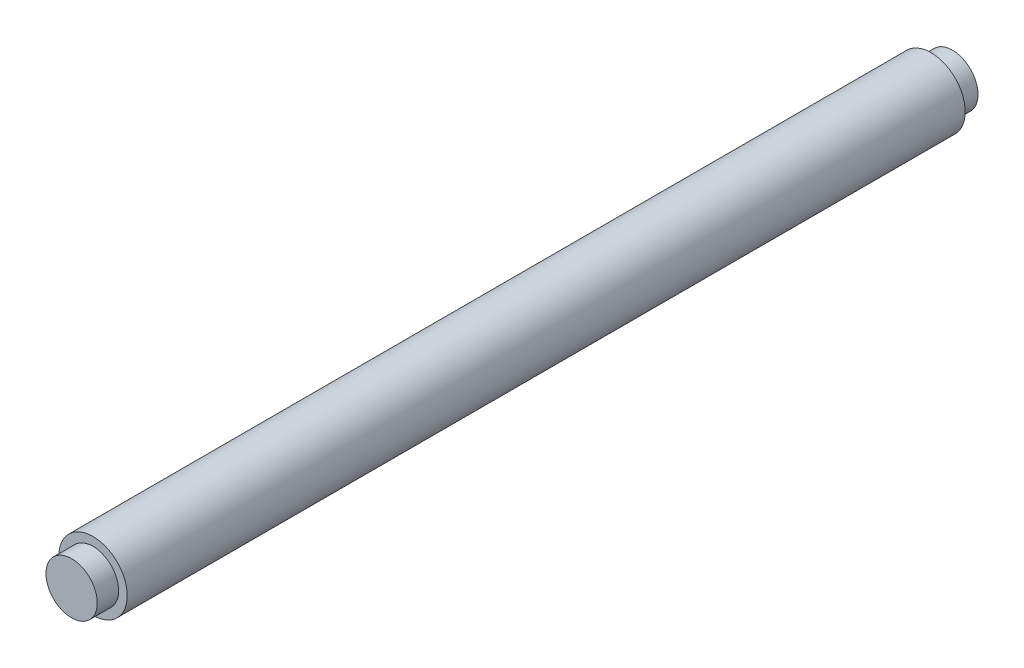
ISO-10303-21;
HEADER;
FILE_DESCRIPTION(('STEP AP214'),'2;1');
FILE_NAME('part.step','',(''),(''),'','','');
FILE_SCHEMA(('AUTOMOTIVE_DESIGN { 1 0 10303 214 1 1 1 1 }'));
ENDSEC;
DATA;
#1=APPLICATION_CONTEXT('core data for automotive mechanical design processes');
#2=APPLICATION_PROTOCOL_DEFINITION('international standard','automotive_design',2000,#1);
#3=PRODUCT_CONTEXT('',#1,'mechanical');
#4=PRODUCT('Part','Part','',(#3));
#5=PRODUCT_RELATED_PRODUCT_CATEGORY('part','',(#4));
#6=PRODUCT_DEFINITION_FORMATION('','',#4);
#7=PRODUCT_DEFINITION_CONTEXT('part definition',#1,'design');
#8=PRODUCT_DEFINITION('design','',#6,#7);
#9=PRODUCT_DEFINITION_SHAPE('','',#8);
#10=(LENGTH_UNIT() NAMED_UNIT(*) SI_UNIT(.MILLI.,.METRE.));
#11=(NAMED_UNIT(*) PLANE_ANGLE_UNIT() SI_UNIT($,.RADIAN.));
#12=(NAMED_UNIT(*) SI_UNIT($,.STERADIAN.) SOLID_ANGLE_UNIT());
#13=UNCERTAINTY_MEASURE_WITH_UNIT(LENGTH_MEASURE(1.E-05),#10,'distance_accuracy_value','');
#14=(GEOMETRIC_REPRESENTATION_CONTEXT(3) GLOBAL_UNCERTAINTY_ASSIGNED_CONTEXT((#13)) GLOBAL_UNIT_ASSIGNED_CONTEXT((#10,
#11,#12)) REPRESENTATION_CONTEXT('',''));
#15=CARTESIAN_POINT('',(0.,0.,0.));
#16=DIRECTION('',(0.,0.,1.));
#17=DIRECTION('',(1.,0.,0.));
#18=AXIS2_PLACEMENT_3D('',#15,#16,#17);
#19=CARTESIAN_POINT('',(0.,0.,0.));
#20=DIRECTION('',(0.,0.,1.));
#21=DIRECTION('',(1.,0.,0.));
#22=AXIS2_PLACEMENT_3D('',#19,#20,#21);
#23=PLANE('',#22);
#24=CARTESIAN_POINT('',(0.,0.,0.));
#25=DIRECTION('',(0.,0.,1.));
#26=DIRECTION('',(1.,0.,0.));
#27=AXIS2_PLACEMENT_3D('',#24,#25,#26);
#28=CIRCLE('',#27,4.);
#29=CARTESIAN_POINT('',(4.,0.,0.));
#30=VERTEX_POINT('',#29);
#31=EDGE_CURVE('E48',#30,#30,#28,.T.);
#32=ORIENTED_EDGE('',*,*,#31,.F.);
#33=EDGE_LOOP('',(#32));
#34=FACE_BOUND('',#33,.T.);
#35=CARTESIAN_POINT('',(0.,0.,0.));
#36=DIRECTION('',(0.,0.,-1.));
#37=DIRECTION('',(-1.,0.,0.));
#38=AXIS2_PLACEMENT_3D('',#35,#36,#37);
#39=CIRCLE('',#38,3.);
#40=CARTESIAN_POINT('',(-3.,0.,0.));
#41=VERTEX_POINT('',#40);
#42=EDGE_CURVE('E10',#41,#41,#39,.T.);
#43=ORIENTED_EDGE('',*,*,#42,.F.);
#44=EDGE_LOOP('',(#43));
#45=FACE_BOUND('',#44,.T.);
#46=ADVANCED_FACE('F28',(#34,#45),#23,.F.);
#47=CARTESIAN_POINT('',(0.,0.,98.));
#48=DIRECTION('',(0.,0.,-1.));
#49=DIRECTION('',(-1.,0.,0.));
#50=AXIS2_PLACEMENT_3D('',#47,#48,#49);
#51=CYLINDRICAL_SURFACE('',#50,4.);
#52=CARTESIAN_POINT('',(0.,0.,98.));
#53=DIRECTION('',(0.,0.,1.));
#54=DIRECTION('',(1.,0.,0.));
#55=AXIS2_PLACEMENT_3D('',#52,#53,#54);
#56=CIRCLE('',#55,4.);
#57=CARTESIAN_POINT('',(4.,0.,98.));
#58=VERTEX_POINT('',#57);
#59=EDGE_CURVE('E32',#58,#58,#56,.T.);
#60=ORIENTED_EDGE('',*,*,#59,.F.);
#61=EDGE_LOOP('',(#60));
#62=FACE_BOUND('',#61,.T.);
#63=ORIENTED_EDGE('',*,*,#31,.T.);
#64=EDGE_LOOP('',(#63));
#65=FACE_BOUND('',#64,.T.);
#66=ADVANCED_FACE('F30',(#62,#65),#51,.T.);
#67=CARTESIAN_POINT('',(0.,0.,98.));
#68=DIRECTION('',(0.,0.,1.));
#69=DIRECTION('',(1.,0.,0.));
#70=AXIS2_PLACEMENT_3D('',#67,#68,#69);
#71=PLANE('',#70);
#72=CARTESIAN_POINT('',(0.,0.,98.));
#73=DIRECTION('',(0.,0.,1.));
#74=DIRECTION('',(1.,0.,0.));
#75=AXIS2_PLACEMENT_3D('',#72,#73,#74);
#76=CIRCLE('',#75,3.);
#77=CARTESIAN_POINT('',(3.,0.,98.));
#78=VERTEX_POINT('',#77);
#79=EDGE_CURVE('E36',#78,#78,#76,.T.);
#80=ORIENTED_EDGE('',*,*,#79,.F.);
#81=EDGE_LOOP('',(#80));
#82=FACE_BOUND('',#81,.T.);
#83=ORIENTED_EDGE('',*,*,#59,.T.);
#84=EDGE_LOOP('',(#83));
#85=FACE_BOUND('',#84,.T.);
#86=ADVANCED_FACE('F55',(#82,#85),#71,.T.);
#87=CARTESIAN_POINT('',(0.,0.,100.5));
#88=DIRECTION('',(0.,0.,-1.));
#89=DIRECTION('',(-1.,0.,0.));
#90=AXIS2_PLACEMENT_3D('',#87,#88,#89);
#91=CYLINDRICAL_SURFACE('',#90,3.);
#92=CARTESIAN_POINT('',(0.,0.,100.5));
#93=DIRECTION('',(0.,0.,1.));
#94=DIRECTION('',(1.,0.,0.));
#95=AXIS2_PLACEMENT_3D('',#92,#93,#94);
#96=CIRCLE('',#95,3.);
#97=CARTESIAN_POINT('',(3.,0.,100.5));
#98=VERTEX_POINT('',#97);
#99=EDGE_CURVE('E45',#98,#98,#96,.T.);
#100=ORIENTED_EDGE('',*,*,#99,.F.);
#101=EDGE_LOOP('',(#100));
#102=FACE_BOUND('',#101,.T.);
#103=ORIENTED_EDGE('',*,*,#79,.T.);
#104=EDGE_LOOP('',(#103));
#105=FACE_BOUND('',#104,.T.);
#106=ADVANCED_FACE('F62',(#102,#105),#91,.T.);
#107=CARTESIAN_POINT('',(0.,0.,100.5));
#108=DIRECTION('',(0.,0.,1.));
#109=DIRECTION('',(1.,0.,0.));
#110=AXIS2_PLACEMENT_3D('',#107,#108,#109);
#111=PLANE('',#110);
#112=ORIENTED_EDGE('',*,*,#99,.T.);
#113=EDGE_LOOP('',(#112));
#114=FACE_BOUND('',#113,.T.);
#115=ADVANCED_FACE('F72',(#114),#111,.T.);
#116=CARTESIAN_POINT('',(0.,0.,-2.5));
#117=DIRECTION('',(0.,0.,1.));
#118=DIRECTION('',(1.,0.,0.));
#119=AXIS2_PLACEMENT_3D('',#116,#117,#118);
#120=CYLINDRICAL_SURFACE('',#119,3.);
#121=CARTESIAN_POINT('',(0.,0.,-2.5));
#122=DIRECTION('',(0.,0.,-1.));
#123=DIRECTION('',(-1.,0.,0.));
#124=AXIS2_PLACEMENT_3D('',#121,#122,#123);
#125=CIRCLE('',#124,3.);
#126=CARTESIAN_POINT('',(-3.,0.,-2.5));
#127=VERTEX_POINT('',#126);
#128=EDGE_CURVE('E43',#127,#127,#125,.T.);
#129=ORIENTED_EDGE('',*,*,#128,.F.);
#130=EDGE_LOOP('',(#129));
#131=FACE_BOUND('',#130,.T.);
#132=ORIENTED_EDGE('',*,*,#42,.T.);
#133=EDGE_LOOP('',(#132));
#134=FACE_BOUND('',#133,.T.);
#135=ADVANCED_FACE('F76',(#131,#134),#120,.T.);
#136=CARTESIAN_POINT('',(0.,0.,-2.5));
#137=DIRECTION('',(0.,0.,-1.));
#138=DIRECTION('',(-1.,0.,0.));
#139=AXIS2_PLACEMENT_3D('',#136,#137,#138);
#140=PLANE('',#139);
#141=ORIENTED_EDGE('',*,*,#128,.T.);
#142=EDGE_LOOP('',(#141));
#143=FACE_BOUND('',#142,.T.);
#144=ADVANCED_FACE('F80',(#143),#140,.T.);
#145=CLOSED_SHELL('',(#46,#66,#86,#106,#115,#135,#144));
#146=MANIFOLD_SOLID_BREP('B2',#145);
#147=ADVANCED_BREP_SHAPE_REPRESENTATION('',(#18,#146),#14);
#148=SHAPE_DEFINITION_REPRESENTATION(#9,#147);
ENDSEC;
END-ISO-10303-21;
